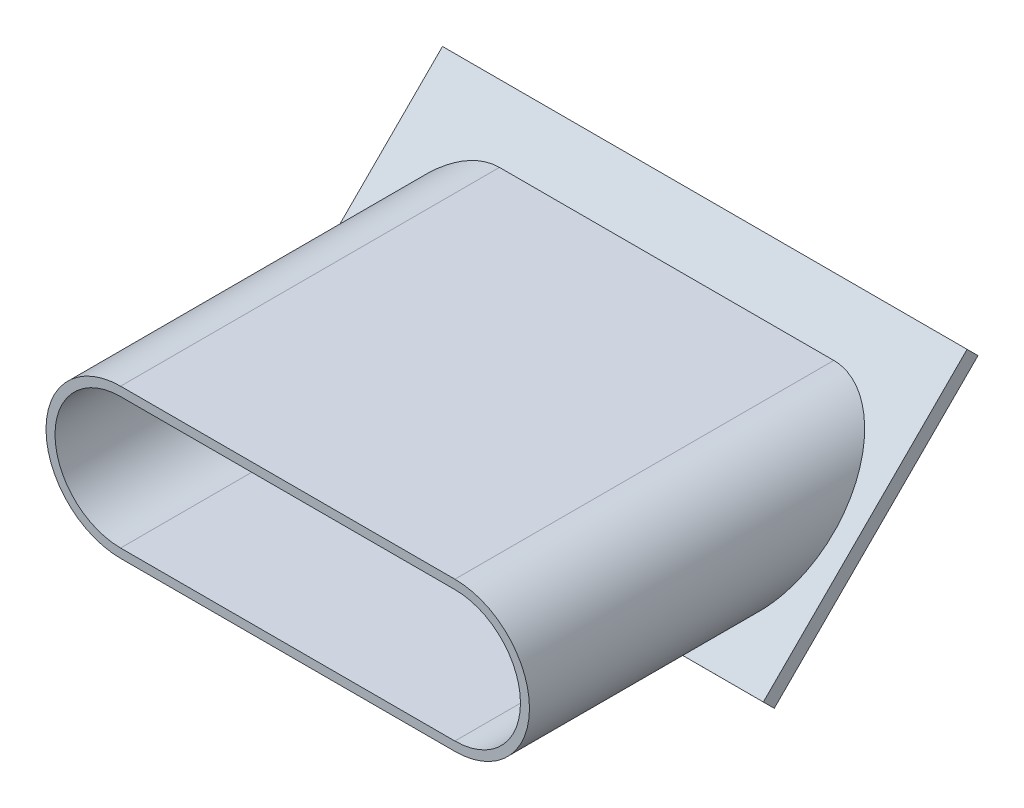
ISO-10303-21;
HEADER;
FILE_DESCRIPTION(('STEP AP214'),'2;1');
FILE_NAME('part.step','',(''),(''),'','','');
FILE_SCHEMA(('AUTOMOTIVE_DESIGN { 1 0 10303 214 1 1 1 1 }'));
ENDSEC;
DATA;
#1=APPLICATION_CONTEXT('core data for automotive mechanical design processes');
#2=APPLICATION_PROTOCOL_DEFINITION('international standard','automotive_design',2000,#1);
#3=PRODUCT_CONTEXT('',#1,'mechanical');
#4=PRODUCT('Part','Part','',(#3));
#5=PRODUCT_RELATED_PRODUCT_CATEGORY('part','',(#4));
#6=PRODUCT_DEFINITION_FORMATION('','',#4);
#7=PRODUCT_DEFINITION_CONTEXT('part definition',#1,'design');
#8=PRODUCT_DEFINITION('design','',#6,#7);
#9=PRODUCT_DEFINITION_SHAPE('','',#8);
#10=(LENGTH_UNIT() NAMED_UNIT(*) SI_UNIT(.MILLI.,.METRE.));
#11=(NAMED_UNIT(*) PLANE_ANGLE_UNIT() SI_UNIT($,.RADIAN.));
#12=(NAMED_UNIT(*) SI_UNIT($,.STERADIAN.) SOLID_ANGLE_UNIT());
#13=UNCERTAINTY_MEASURE_WITH_UNIT(LENGTH_MEASURE(1.E-05),#10,'distance_accuracy_value','');
#14=(GEOMETRIC_REPRESENTATION_CONTEXT(3) GLOBAL_UNCERTAINTY_ASSIGNED_CONTEXT((#13)) GLOBAL_UNIT_ASSIGNED_CONTEXT((#10,
#11,#12)) REPRESENTATION_CONTEXT('',''));
#15=CARTESIAN_POINT('',(0.,0.,0.));
#16=DIRECTION('',(0.,0.,1.));
#17=DIRECTION('',(1.,0.,0.));
#18=AXIS2_PLACEMENT_3D('',#15,#16,#17);
#19=CARTESIAN_POINT('',(0.,14.5,80.0000000000001));
#20=DIRECTION('',(0.,-1.,0.));
#21=DIRECTION('',(0.,0.,-1.));
#22=AXIS2_PLACEMENT_3D('',#19,#20,#21);
#23=PLANE('',#22);
#24=DIRECTION('',(-1.,0.,0.));
#25=VECTOR('',#24,1.);
#26=CARTESIAN_POINT('',(0.,14.5,77.9153607316516));
#27=LINE('',#26,#25);
#28=CARTESIAN_POINT('',(32.5000000000001,14.5,77.9153607316516));
#29=VERTEX_POINT('',#28);
#30=CARTESIAN_POINT('',(-32.5000000000001,14.5,77.9153607316516));
#31=VERTEX_POINT('',#30);
#32=EDGE_CURVE('E127',#29,#31,#27,.T.);
#33=ORIENTED_EDGE('',*,*,#32,.F.);
#34=DIRECTION('',(0.,0.,-1.));
#35=VECTOR('',#34,1.);
#36=CARTESIAN_POINT('',(32.5000000000001,14.5,80.0000000000001));
#37=LINE('',#36,#35);
#38=CARTESIAN_POINT('',(32.5000000000001,14.5,4.24460595078653));
#39=VERTEX_POINT('',#38);
#40=EDGE_CURVE('E149',#29,#39,#37,.T.);
#41=ORIENTED_EDGE('',*,*,#40,.T.);
#42=DIRECTION('',(-1.,0.,0.));
#43=VECTOR('',#42,1.);
#44=CARTESIAN_POINT('',(0.,14.5,4.24460595078653));
#45=LINE('',#44,#43);
#46=CARTESIAN_POINT('',(-32.5000000000001,14.5,4.24460595078652));
#47=VERTEX_POINT('',#46);
#48=EDGE_CURVE('E225',#39,#47,#45,.T.);
#49=ORIENTED_EDGE('',*,*,#48,.T.);
#50=DIRECTION('',(0.,0.,-1.));
#51=VECTOR('',#50,1.);
#52=CARTESIAN_POINT('',(-32.5000000000001,14.5,80.0000000000001));
#53=LINE('',#52,#51);
#54=EDGE_CURVE('E145',#31,#47,#53,.T.);
#55=ORIENTED_EDGE('',*,*,#54,.F.);
#56=EDGE_LOOP('',(#33,#41,#49,#55));
#57=FACE_BOUND('',#56,.T.);
#58=ADVANCED_FACE('F39',(#57),#23,.F.);
#59=CARTESIAN_POINT('',(-32.5000000000001,0.,80.0000000000001));
#60=DIRECTION('',(0.,0.,-1.));
#61=DIRECTION('',(-1.,0.,0.));
#62=AXIS2_PLACEMENT_3D('',#59,#60,#61);
#63=CYLINDRICAL_SURFACE('',#62,14.5);
#64=CARTESIAN_POINT('',(-32.5000000000001,0.,77.9153607316516));
#65=DIRECTION('',(0.,0.,1.));
#66=DIRECTION('',(1.,0.,0.));
#67=AXIS2_PLACEMENT_3D('',#64,#65,#66);
#68=CIRCLE('',#67,14.5);
#69=CARTESIAN_POINT('',(-32.5000000000001,-14.5,77.9153607316516));
#70=VERTEX_POINT('',#69);
#71=EDGE_CURVE('E124',#31,#70,#68,.T.);
#72=ORIENTED_EDGE('',*,*,#71,.F.);
#73=ORIENTED_EDGE('',*,*,#54,.T.);
#74=CARTESIAN_POINT('',(-32.5000000000001,0.,18.7580361379704));
#75=DIRECTION('',(0.,0.707434021964028,0.706779388895714));
#76=DIRECTION('',(0.,0.706779388895714,-0.707434021964028));
#77=AXIS2_PLACEMENT_3D('',#74,#75,#76);
#78=ELLIPSE('',#77,20.5155954288015,14.5);
#79=CARTESIAN_POINT('',(-32.5000000000001,-14.5,33.2714663251542));
#80=VERTEX_POINT('',#79);
#81=EDGE_CURVE('E144',#47,#80,#78,.T.);
#82=ORIENTED_EDGE('',*,*,#81,.T.);
#83=DIRECTION('',(0.,0.,-1.));
#84=VECTOR('',#83,1.);
#85=CARTESIAN_POINT('',(-32.5000000000001,-14.5,80.0000000000001));
#86=LINE('',#85,#84);
#87=EDGE_CURVE('E137',#70,#80,#86,.T.);
#88=ORIENTED_EDGE('',*,*,#87,.F.);
#89=EDGE_LOOP('',(#72,#73,#82,#88));
#90=FACE_BOUND('',#89,.T.);
#91=ADVANCED_FACE('F142',(#90),#63,.T.);
#92=CARTESIAN_POINT('',(0.,-14.5,80.0000000000001));
#93=DIRECTION('',(0.,-1.,0.));
#94=DIRECTION('',(0.,0.,-1.));
#95=AXIS2_PLACEMENT_3D('',#92,#93,#94);
#96=PLANE('',#95);
#97=DIRECTION('',(0.,0.,-1.));
#98=VECTOR('',#97,1.);
#99=CARTESIAN_POINT('',(32.5000000000001,-14.5,80.0000000000001));
#100=LINE('',#99,#98);
#101=CARTESIAN_POINT('',(32.5000000000001,-14.5,77.9153607316516));
#102=VERTEX_POINT('',#101);
#103=CARTESIAN_POINT('',(32.5000000000001,-14.5,33.2714663251543));
#104=VERTEX_POINT('',#103);
#105=EDGE_CURVE('E139',#102,#104,#100,.T.);
#106=ORIENTED_EDGE('',*,*,#105,.F.);
#107=DIRECTION('',(-1.,0.,0.));
#108=VECTOR('',#107,1.);
#109=CARTESIAN_POINT('',(69.7281455494334,-14.5,77.9153607316516));
#110=LINE('',#109,#108);
#111=EDGE_CURVE('E53',#102,#70,#110,.T.);
#112=ORIENTED_EDGE('',*,*,#111,.T.);
#113=ORIENTED_EDGE('',*,*,#87,.T.);
#114=DIRECTION('',(-1.,0.,0.));
#115=VECTOR('',#114,1.);
#116=CARTESIAN_POINT('',(0.,-14.5,33.2714663251543));
#117=LINE('',#116,#115);
#118=EDGE_CURVE('E217',#104,#80,#117,.T.);
#119=ORIENTED_EDGE('',*,*,#118,.F.);
#120=EDGE_LOOP('',(#106,#112,#113,#119));
#121=FACE_BOUND('',#120,.T.);
#122=ADVANCED_FACE('F135',(#121),#96,.T.);
#123=CARTESIAN_POINT('',(32.5000000000001,0.,80.0000000000001));
#124=DIRECTION('',(0.,0.,-1.));
#125=DIRECTION('',(-1.,0.,0.));
#126=AXIS2_PLACEMENT_3D('',#123,#124,#125);
#127=CYLINDRICAL_SURFACE('',#126,14.5);
#128=CARTESIAN_POINT('',(32.5000000000001,0.,77.9153607316516));
#129=DIRECTION('',(0.,0.,1.));
#130=DIRECTION('',(1.,0.,0.));
#131=AXIS2_PLACEMENT_3D('',#128,#129,#130);
#132=CIRCLE('',#131,14.5);
#133=EDGE_CURVE('E236',#102,#29,#132,.T.);
#134=ORIENTED_EDGE('',*,*,#133,.F.);
#135=ORIENTED_EDGE('',*,*,#105,.T.);
#136=CARTESIAN_POINT('',(32.5000000000001,0.,18.7580361379704));
#137=DIRECTION('',(0.,0.707434021964028,0.706779388895714));
#138=DIRECTION('',(0.,0.706779388895714,-0.707434021964028));
#139=AXIS2_PLACEMENT_3D('',#136,#137,#138);
#140=ELLIPSE('',#139,20.5155954288015,14.5);
#141=EDGE_CURVE('E147',#104,#39,#140,.T.);
#142=ORIENTED_EDGE('',*,*,#141,.T.);
#143=ORIENTED_EDGE('',*,*,#40,.F.);
#144=EDGE_LOOP('',(#134,#135,#142,#143));
#145=FACE_BOUND('',#144,.T.);
#146=ADVANCED_FACE('F235',(#145),#127,.T.);
#147=CARTESIAN_POINT('',(-32.5000000000001,0.,-5.29472242780894));
#148=DIRECTION('',(0.,0.,1.));
#149=DIRECTION('',(1.,0.,0.));
#150=AXIS2_PLACEMENT_3D('',#147,#148,#149);
#151=CYLINDRICAL_SURFACE('',#150,12.75);
#152=CARTESIAN_POINT('',(-32.5000000000001,0.,77.9153607316516));
#153=DIRECTION('',(0.,0.,1.));
#154=DIRECTION('',(1.,0.,0.));
#155=AXIS2_PLACEMENT_3D('',#152,#153,#154);
#156=CIRCLE('',#155,12.75);
#157=CARTESIAN_POINT('',(-32.5000000000001,-12.75,77.9153607316516));
#158=VERTEX_POINT('',#157);
#159=CARTESIAN_POINT('',(-32.5000000000001,12.75,77.9153607316516));
#160=VERTEX_POINT('',#159);
#161=EDGE_CURVE('E237',#158,#160,#156,.F.);
#162=ORIENTED_EDGE('',*,*,#161,.F.);
#163=DIRECTION('',(0.,0.,1.));
#164=VECTOR('',#163,1.);
#165=CARTESIAN_POINT('',(-32.5000000000001,-12.75,-5.29472242780894));
#166=LINE('',#165,#164);
#167=CARTESIAN_POINT('',(-32.5000000000001,-12.75,27.2752394897076));
#168=VERTEX_POINT('',#167);
#169=EDGE_CURVE('E131',#168,#158,#166,.T.);
#170=ORIENTED_EDGE('',*,*,#169,.F.);
#171=CARTESIAN_POINT('',(-32.5000000000001,0.,14.5134301871838));
#172=DIRECTION('',(0.,0.707434021964029,0.706779388895714));
#173=DIRECTION('',(0.,-0.706779388895714,0.707434021964029));
#174=AXIS2_PLACEMENT_3D('',#171,#172,#173);
#175=ELLIPSE('',#174,18.0395752908427,12.75);
#176=CARTESIAN_POINT('',(-32.5000000000001,12.75,1.75162088466012));
#177=VERTEX_POINT('',#176);
#178=EDGE_CURVE('E46',#177,#168,#175,.T.);
#179=ORIENTED_EDGE('',*,*,#178,.F.);
#180=DIRECTION('',(0.,0.,1.));
#181=VECTOR('',#180,1.);
#182=CARTESIAN_POINT('',(-32.5000000000001,12.75,-5.29472242780894));
#183=LINE('',#182,#181);
#184=EDGE_CURVE('E173',#177,#160,#183,.T.);
#185=ORIENTED_EDGE('',*,*,#184,.T.);
#186=EDGE_LOOP('',(#162,#170,#179,#185));
#187=FACE_BOUND('',#186,.T.);
#188=ADVANCED_FACE('F172',(#187),#151,.F.);
#189=CARTESIAN_POINT('',(-32.5000000000001,12.75,-5.29472242780894));
#190=DIRECTION('',(0.,-1.,0.));
#191=DIRECTION('',(1.,0.,0.));
#192=AXIS2_PLACEMENT_3D('',#189,#190,#191);
#193=PLANE('',#192);
#194=DIRECTION('',(0.,0.,1.));
#195=VECTOR('',#194,1.);
#196=CARTESIAN_POINT('',(32.5000000000001,12.75,-5.29472242780894));
#197=LINE('',#196,#195);
#198=CARTESIAN_POINT('',(32.5000000000001,12.75,1.75162088466014));
#199=VERTEX_POINT('',#198);
#200=CARTESIAN_POINT('',(32.5000000000001,12.75,77.9153607316516));
#201=VERTEX_POINT('',#200);
#202=EDGE_CURVE('E182',#199,#201,#197,.T.);
#203=ORIENTED_EDGE('',*,*,#202,.T.);
#204=DIRECTION('',(-1.,0.,0.));
#205=VECTOR('',#204,1.);
#206=CARTESIAN_POINT('',(-32.5000000000001,12.75,77.9153607316516));
#207=LINE('',#206,#205);
#208=EDGE_CURVE('E180',#201,#160,#207,.T.);
#209=ORIENTED_EDGE('',*,*,#208,.T.);
#210=ORIENTED_EDGE('',*,*,#184,.F.);
#211=DIRECTION('',(1.,0.,0.));
#212=VECTOR('',#211,1.);
#213=CARTESIAN_POINT('',(-47.0000000000001,12.75,1.75162088466011));
#214=LINE('',#213,#212);
#215=EDGE_CURVE('E161',#177,#199,#214,.T.);
#216=ORIENTED_EDGE('',*,*,#215,.T.);
#217=EDGE_LOOP('',(#203,#209,#210,#216));
#218=FACE_BOUND('',#217,.T.);
#219=ADVANCED_FACE('F178',(#218),#193,.T.);
#220=CARTESIAN_POINT('',(32.5000000000001,0.,-5.29472242780894));
#221=DIRECTION('',(0.,0.,1.));
#222=DIRECTION('',(1.,0.,0.));
#223=AXIS2_PLACEMENT_3D('',#220,#221,#222);
#224=CYLINDRICAL_SURFACE('',#223,12.75);
#225=CARTESIAN_POINT('',(32.5000000000001,0.,77.9153607316516));
#226=DIRECTION('',(0.,0.,1.));
#227=DIRECTION('',(1.,0.,0.));
#228=AXIS2_PLACEMENT_3D('',#225,#226,#227);
#229=CIRCLE('',#228,12.75);
#230=CARTESIAN_POINT('',(32.5000000000001,-12.75,77.9153607316516));
#231=VERTEX_POINT('',#230);
#232=EDGE_CURVE('E60',#201,#231,#229,.F.);
#233=ORIENTED_EDGE('',*,*,#232,.F.);
#234=ORIENTED_EDGE('',*,*,#202,.F.);
#235=CARTESIAN_POINT('',(32.5000000000001,0.,14.5134301871839));
#236=DIRECTION('',(0.,0.707434021964029,0.706779388895714));
#237=DIRECTION('',(0.,-0.706779388895714,0.707434021964029));
#238=AXIS2_PLACEMENT_3D('',#235,#236,#237);
#239=ELLIPSE('',#238,18.0395752908427,12.75);
#240=CARTESIAN_POINT('',(32.5000000000001,-12.75,27.2752394897076));
#241=VERTEX_POINT('',#240);
#242=EDGE_CURVE('E158',#241,#199,#239,.T.);
#243=ORIENTED_EDGE('',*,*,#242,.F.);
#244=DIRECTION('',(0.,0.,1.));
#245=VECTOR('',#244,1.);
#246=CARTESIAN_POINT('',(32.5000000000001,-12.75,-5.29472242780894));
#247=LINE('',#246,#245);
#248=EDGE_CURVE('E187',#241,#231,#247,.T.);
#249=ORIENTED_EDGE('',*,*,#248,.T.);
#250=EDGE_LOOP('',(#233,#234,#243,#249));
#251=FACE_BOUND('',#250,.T.);
#252=ADVANCED_FACE('F246',(#251),#224,.F.);
#253=CARTESIAN_POINT('',(-32.5000000000001,-12.75,-5.29472242780894));
#254=DIRECTION('',(0.,-1.,0.));
#255=DIRECTION('',(1.,0.,0.));
#256=AXIS2_PLACEMENT_3D('',#253,#254,#255);
#257=PLANE('',#256);
#258=DIRECTION('',(-1.,0.,0.));
#259=VECTOR('',#258,1.);
#260=CARTESIAN_POINT('',(-32.5000000000001,-12.75,77.9153607316516));
#261=LINE('',#260,#259);
#262=EDGE_CURVE('E11',#231,#158,#261,.T.);
#263=ORIENTED_EDGE('',*,*,#262,.F.);
#264=ORIENTED_EDGE('',*,*,#248,.F.);
#265=DIRECTION('',(1.,0.,0.));
#266=VECTOR('',#265,1.);
#267=CARTESIAN_POINT('',(-47.0000000000001,-12.75,27.2752394897076));
#268=LINE('',#267,#266);
#269=EDGE_CURVE('E155',#168,#241,#268,.T.);
#270=ORIENTED_EDGE('',*,*,#269,.F.);
#271=ORIENTED_EDGE('',*,*,#169,.T.);
#272=EDGE_LOOP('',(#263,#264,#270,#271));
#273=FACE_BOUND('',#272,.T.);
#274=ADVANCED_FACE('F243',(#273),#257,.F.);
#275=CARTESIAN_POINT('',(51.,21.9121249549721,-3.17438426112178));
#276=DIRECTION('',(1.,0.,0.));
#277=DIRECTION('',(0.,0.,-1.));
#278=AXIS2_PLACEMENT_3D('',#275,#276,#277);
#279=PLANE('',#278);
#280=DIRECTION('',(0.,-0.706779388895714,0.707434021964028));
#281=VECTOR('',#280,1.);
#282=CARTESIAN_POINT('',(51.,19.78982288908,-5.29472242780892));
#283=LINE('',#282,#281);
#284=CARTESIAN_POINT('',(51.,19.78982288908,-5.29472242780892));
#285=VERTEX_POINT('',#284);
#286=CARTESIAN_POINT('',(51.,-19.78982288908,34.3215828021767));
#287=VERTEX_POINT('',#286);
#288=EDGE_CURVE('E181',#285,#287,#283,.T.);
#289=ORIENTED_EDGE('',*,*,#288,.F.);
#290=DIRECTION('',(0.,-0.707434021964028,-0.706779388895714));
#291=VECTOR('',#290,1.);
#292=CARTESIAN_POINT('',(51.,21.9121249549721,-3.17438426112178));
#293=LINE('',#292,#291);
#294=CARTESIAN_POINT('',(51.,21.9121249549721,-3.17438426112178));
#295=VERTEX_POINT('',#294);
#296=EDGE_CURVE('E215',#295,#285,#293,.T.);
#297=ORIENTED_EDGE('',*,*,#296,.F.);
#298=DIRECTION('',(0.,-0.706779388895714,0.707434021964028));
#299=VECTOR('',#298,1.);
#300=CARTESIAN_POINT('',(51.,21.9121249549721,-3.17438426112178));
#301=LINE('',#300,#299);
#302=CARTESIAN_POINT('',(51.,-17.6675208231879,36.4419209688638));
#303=VERTEX_POINT('',#302);
#304=EDGE_CURVE('E194',#295,#303,#301,.T.);
#305=ORIENTED_EDGE('',*,*,#304,.T.);
#306=DIRECTION('',(0.,-0.707434021964028,-0.706779388895714));
#307=VECTOR('',#306,1.);
#308=CARTESIAN_POINT('',(51.,-17.6675208231879,36.4419209688638));
#309=LINE('',#308,#307);
#310=EDGE_CURVE('E206',#303,#287,#309,.T.);
#311=ORIENTED_EDGE('',*,*,#310,.T.);
#312=EDGE_LOOP('',(#289,#297,#305,#311));
#313=FACE_BOUND('',#312,.T.);
#314=ADVANCED_FACE('F253',(#313),#279,.T.);
#315=CARTESIAN_POINT('',(-51.,21.9121249549721,-3.1743842611218));
#316=DIRECTION('',(0.,0.706779388895714,-0.707434021964028));
#317=DIRECTION('',(0.,0.707434021964028,0.706779388895714));
#318=AXIS2_PLACEMENT_3D('',#315,#316,#317);
#319=PLANE('',#318);
#320=DIRECTION('',(1.,0.,0.));
#321=VECTOR('',#320,1.);
#322=CARTESIAN_POINT('',(-51.,19.78982288908,-5.29472242780894));
#323=LINE('',#322,#321);
#324=CARTESIAN_POINT('',(-51.,19.78982288908,-5.29472242780894));
#325=VERTEX_POINT('',#324);
#326=EDGE_CURVE('E198',#325,#285,#323,.T.);
#327=ORIENTED_EDGE('',*,*,#326,.F.);
#328=DIRECTION('',(0.,-0.707434021964028,-0.706779388895714));
#329=VECTOR('',#328,1.);
#330=CARTESIAN_POINT('',(-51.,21.9121249549721,-3.1743842611218));
#331=LINE('',#330,#329);
#332=CARTESIAN_POINT('',(-51.,21.9121249549721,-3.1743842611218));
#333=VERTEX_POINT('',#332);
#334=EDGE_CURVE('E218',#333,#325,#331,.T.);
#335=ORIENTED_EDGE('',*,*,#334,.F.);
#336=DIRECTION('',(1.,0.,0.));
#337=VECTOR('',#336,1.);
#338=CARTESIAN_POINT('',(-51.,21.9121249549721,-3.1743842611218));
#339=LINE('',#338,#337);
#340=EDGE_CURVE('E204',#333,#295,#339,.T.);
#341=ORIENTED_EDGE('',*,*,#340,.T.);
#342=ORIENTED_EDGE('',*,*,#296,.T.);
#343=EDGE_LOOP('',(#327,#335,#341,#342));
#344=FACE_BOUND('',#343,.T.);
#345=ADVANCED_FACE('F271',(#344),#319,.T.);
#346=CARTESIAN_POINT('',(-51.,21.9121249549721,-3.1743842611218));
#347=DIRECTION('',(-1.,0.,0.));
#348=DIRECTION('',(0.,-1.,0.));
#349=AXIS2_PLACEMENT_3D('',#346,#347,#348);
#350=PLANE('',#349);
#351=DIRECTION('',(0.,0.706779388895714,-0.707434021964028));
#352=VECTOR('',#351,1.);
#353=CARTESIAN_POINT('',(-51.,19.78982288908,-5.29472242780894));
#354=LINE('',#353,#352);
#355=CARTESIAN_POINT('',(-51.,-19.78982288908,34.3215828021766));
#356=VERTEX_POINT('',#355);
#357=EDGE_CURVE('E210',#356,#325,#354,.T.);
#358=ORIENTED_EDGE('',*,*,#357,.F.);
#359=DIRECTION('',(0.,-0.707434021964028,-0.706779388895714));
#360=VECTOR('',#359,1.);
#361=CARTESIAN_POINT('',(-51.,-17.6675208231879,36.4419209688638));
#362=LINE('',#361,#360);
#363=CARTESIAN_POINT('',(-51.,-17.6675208231879,36.4419209688638));
#364=VERTEX_POINT('',#363);
#365=EDGE_CURVE('E220',#364,#356,#362,.T.);
#366=ORIENTED_EDGE('',*,*,#365,.F.);
#367=DIRECTION('',(0.,0.706779388895714,-0.707434021964028));
#368=VECTOR('',#367,1.);
#369=CARTESIAN_POINT('',(-51.,21.9121249549721,-3.1743842611218));
#370=LINE('',#369,#368);
#371=EDGE_CURVE('E201',#364,#333,#370,.T.);
#372=ORIENTED_EDGE('',*,*,#371,.T.);
#373=ORIENTED_EDGE('',*,*,#334,.T.);
#374=EDGE_LOOP('',(#358,#366,#372,#373));
#375=FACE_BOUND('',#374,.T.);
#376=ADVANCED_FACE('F276',(#375),#350,.T.);
#377=CARTESIAN_POINT('',(-51.,-17.6675208231879,36.4419209688638));
#378=DIRECTION('',(0.,-0.706779388895714,0.707434021964028));
#379=DIRECTION('',(0.,-0.707434021964028,-0.706779388895714));
#380=AXIS2_PLACEMENT_3D('',#377,#378,#379);
#381=PLANE('',#380);
#382=DIRECTION('',(-1.,0.,0.));
#383=VECTOR('',#382,1.);
#384=CARTESIAN_POINT('',(-51.,-19.78982288908,34.3215828021766));
#385=LINE('',#384,#383);
#386=EDGE_CURVE('E185',#287,#356,#385,.T.);
#387=ORIENTED_EDGE('',*,*,#386,.F.);
#388=ORIENTED_EDGE('',*,*,#310,.F.);
#389=DIRECTION('',(-1.,0.,0.));
#390=VECTOR('',#389,1.);
#391=CARTESIAN_POINT('',(-51.,-17.6675208231879,36.4419209688638));
#392=LINE('',#391,#390);
#393=EDGE_CURVE('E197',#303,#364,#392,.T.);
#394=ORIENTED_EDGE('',*,*,#393,.T.);
#395=ORIENTED_EDGE('',*,*,#365,.T.);
#396=EDGE_LOOP('',(#387,#388,#394,#395));
#397=FACE_BOUND('',#396,.T.);
#398=ADVANCED_FACE('F273',(#397),#381,.T.);
#399=CARTESIAN_POINT('',(0.,9.37901404965901,9.37033505973985));
#400=DIRECTION('',(0.,0.707434021964028,0.706779388895714));
#401=DIRECTION('',(0.,-0.706779388895714,0.707434021964028));
#402=AXIS2_PLACEMENT_3D('',#399,#400,#401);
#403=PLANE('',#402);
#404=ORIENTED_EDGE('',*,*,#48,.F.);
#405=ORIENTED_EDGE('',*,*,#141,.F.);
#406=ORIENTED_EDGE('',*,*,#118,.T.);
#407=ORIENTED_EDGE('',*,*,#81,.F.);
#408=EDGE_LOOP('',(#404,#405,#406,#407));
#409=FACE_BOUND('',#408,.T.);
#410=ORIENTED_EDGE('',*,*,#304,.F.);
#411=ORIENTED_EDGE('',*,*,#340,.F.);
#412=ORIENTED_EDGE('',*,*,#371,.F.);
#413=ORIENTED_EDGE('',*,*,#393,.F.);
#414=EDGE_LOOP('',(#410,#411,#412,#413));
#415=FACE_BOUND('',#414,.T.);
#416=ADVANCED_FACE('F233',(#409,#415),#403,.T.);
#417=CARTESIAN_POINT('',(-47.0000000000001,14.5,0.));
#418=DIRECTION('',(0.,0.707434021964029,0.706779388895714));
#419=DIRECTION('',(0.,-0.706779388895714,0.707434021964029));
#420=AXIS2_PLACEMENT_3D('',#417,#418,#419);
#421=PLANE('',#420);
#422=ORIENTED_EDGE('',*,*,#215,.F.);
#423=ORIENTED_EDGE('',*,*,#178,.T.);
#424=ORIENTED_EDGE('',*,*,#269,.T.);
#425=ORIENTED_EDGE('',*,*,#242,.T.);
#426=EDGE_LOOP('',(#422,#423,#424,#425));
#427=FACE_BOUND('',#426,.T.);
#428=ORIENTED_EDGE('',*,*,#288,.T.);
#429=ORIENTED_EDGE('',*,*,#386,.T.);
#430=ORIENTED_EDGE('',*,*,#357,.T.);
#431=ORIENTED_EDGE('',*,*,#326,.T.);
#432=EDGE_LOOP('',(#428,#429,#430,#431));
#433=FACE_BOUND('',#432,.T.);
#434=ADVANCED_FACE('F165',(#427,#433),#421,.F.);
#435=CARTESIAN_POINT('',(69.7281455494334,21.9121249549721,77.9153607316516));
#436=DIRECTION('',(0.,0.,1.));
#437=DIRECTION('',(1.,0.,0.));
#438=AXIS2_PLACEMENT_3D('',#435,#436,#437);
#439=PLANE('',#438);
#440=ORIENTED_EDGE('',*,*,#161,.T.);
#441=ORIENTED_EDGE('',*,*,#208,.F.);
#442=ORIENTED_EDGE('',*,*,#232,.T.);
#443=ORIENTED_EDGE('',*,*,#262,.T.);
#444=EDGE_LOOP('',(#440,#441,#442,#443));
#445=FACE_BOUND('',#444,.T.);
#446=ORIENTED_EDGE('',*,*,#71,.T.);
#447=ORIENTED_EDGE('',*,*,#111,.F.);
#448=ORIENTED_EDGE('',*,*,#133,.T.);
#449=ORIENTED_EDGE('',*,*,#32,.T.);
#450=EDGE_LOOP('',(#446,#447,#448,#449));
#451=FACE_BOUND('',#450,.T.);
#452=ADVANCED_FACE('F125',(#445,#451),#439,.T.);
#453=CLOSED_SHELL('',(#58,#91,#122,#146,#188,#219,#252,#274,#314,#345,#376,#398,#416,#434,#452));
#454=MANIFOLD_SOLID_BREP('B2',#453);
#455=ADVANCED_BREP_SHAPE_REPRESENTATION('',(#18,#454),#14);
#456=SHAPE_DEFINITION_REPRESENTATION(#9,#455);
ENDSEC;
END-ISO-10303-21;
